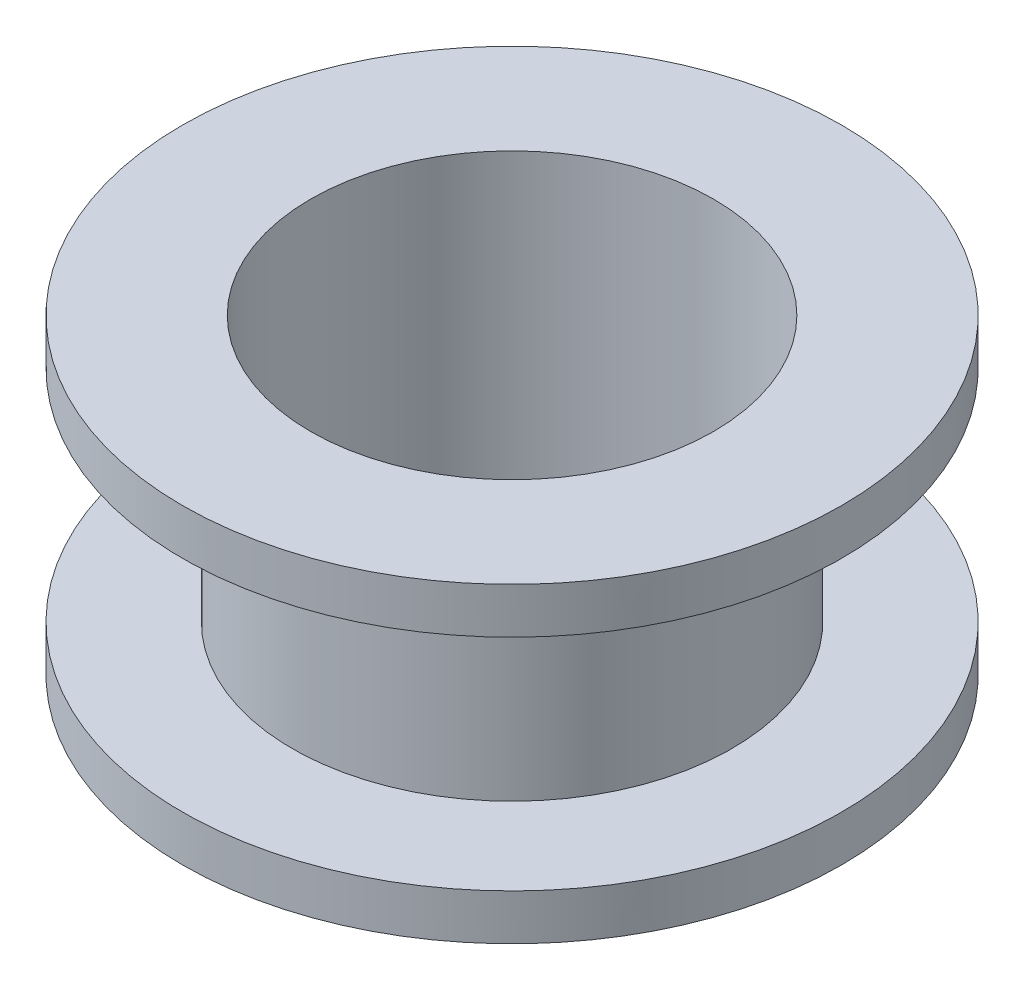
ISO-10303-21;
HEADER;
FILE_DESCRIPTION(('STEP AP214'),'2;1');
FILE_NAME('part.step','',(''),(''),'','','');
FILE_SCHEMA(('AUTOMOTIVE_DESIGN { 1 0 10303 214 1 1 1 1 }'));
ENDSEC;
DATA;
#1=APPLICATION_CONTEXT('core data for automotive mechanical design processes');
#2=APPLICATION_PROTOCOL_DEFINITION('international standard','automotive_design',2000,#1);
#3=PRODUCT_CONTEXT('',#1,'mechanical');
#4=PRODUCT('Part','Part','',(#3));
#5=PRODUCT_RELATED_PRODUCT_CATEGORY('part','',(#4));
#6=PRODUCT_DEFINITION_FORMATION('','',#4);
#7=PRODUCT_DEFINITION_CONTEXT('part definition',#1,'design');
#8=PRODUCT_DEFINITION('design','',#6,#7);
#9=PRODUCT_DEFINITION_SHAPE('','',#8);
#10=(LENGTH_UNIT() NAMED_UNIT(*) SI_UNIT(.MILLI.,.METRE.));
#11=(NAMED_UNIT(*) PLANE_ANGLE_UNIT() SI_UNIT($,.RADIAN.));
#12=(NAMED_UNIT(*) SI_UNIT($,.STERADIAN.) SOLID_ANGLE_UNIT());
#13=UNCERTAINTY_MEASURE_WITH_UNIT(LENGTH_MEASURE(1.E-05),#10,'distance_accuracy_value','');
#14=(GEOMETRIC_REPRESENTATION_CONTEXT(3) GLOBAL_UNCERTAINTY_ASSIGNED_CONTEXT((#13)) GLOBAL_UNIT_ASSIGNED_CONTEXT((#10,
#11,#12)) REPRESENTATION_CONTEXT('',''));
#15=CARTESIAN_POINT('',(0.,0.,0.));
#16=DIRECTION('',(0.,0.,1.));
#17=DIRECTION('',(1.,0.,0.));
#18=AXIS2_PLACEMENT_3D('',#15,#16,#17);
#19=CARTESIAN_POINT('',(0.,8.5,0.));
#20=DIRECTION('',(0.,-1.,0.));
#21=DIRECTION('',(0.,0.,-1.));
#22=AXIS2_PLACEMENT_3D('',#19,#20,#21);
#23=CYLINDRICAL_SURFACE('',#22,9.);
#24=CARTESIAN_POINT('',(0.,1.25,0.));
#25=DIRECTION('',(0.,-1.,0.));
#26=DIRECTION('',(0.,0.,-1.));
#27=AXIS2_PLACEMENT_3D('',#24,#25,#26);
#28=CIRCLE('',#27,9.);
#29=CARTESIAN_POINT('',(0.,1.25,-9.));
#30=VERTEX_POINT('',#29);
#31=EDGE_CURVE('E53',#30,#30,#28,.T.);
#32=ORIENTED_EDGE('',*,*,#31,.T.);
#33=EDGE_LOOP('',(#32));
#34=FACE_BOUND('',#33,.T.);
#35=CARTESIAN_POINT('',(0.,0.,0.));
#36=DIRECTION('',(0.,1.,0.));
#37=DIRECTION('',(0.,0.,1.));
#38=AXIS2_PLACEMENT_3D('',#35,#36,#37);
#39=CIRCLE('',#38,9.);
#40=CARTESIAN_POINT('',(0.,0.,9.));
#41=VERTEX_POINT('',#40);
#42=EDGE_CURVE('E41',#41,#41,#39,.T.);
#43=ORIENTED_EDGE('',*,*,#42,.T.);
#44=EDGE_LOOP('',(#43));
#45=FACE_BOUND('',#44,.T.);
#46=ADVANCED_FACE('F37',(#34,#45),#23,.T.);
#47=CARTESIAN_POINT('',(0.,8.5,0.));
#48=DIRECTION('',(0.,1.,0.));
#49=DIRECTION('',(0.,0.,1.));
#50=AXIS2_PLACEMENT_3D('',#47,#48,#49);
#51=PLANE('',#50);
#52=CARTESIAN_POINT('',(0.,8.5,0.));
#53=DIRECTION('',(0.,1.,0.));
#54=DIRECTION('',(0.,0.,1.));
#55=AXIS2_PLACEMENT_3D('',#52,#53,#54);
#56=CIRCLE('',#55,9.);
#57=CARTESIAN_POINT('',(0.,8.5,9.));
#58=VERTEX_POINT('',#57);
#59=EDGE_CURVE('E10',#58,#58,#56,.T.);
#60=ORIENTED_EDGE('',*,*,#59,.T.);
#61=EDGE_LOOP('',(#60));
#62=FACE_BOUND('',#61,.T.);
#63=CARTESIAN_POINT('',(0.,8.5,0.));
#64=DIRECTION('',(0.,1.,0.));
#65=DIRECTION('',(0.,0.,1.));
#66=AXIS2_PLACEMENT_3D('',#63,#64,#65);
#67=CIRCLE('',#66,5.5);
#68=CARTESIAN_POINT('',(0.,8.5,5.5));
#69=VERTEX_POINT('',#68);
#70=EDGE_CURVE('E48',#69,#69,#67,.T.);
#71=ORIENTED_EDGE('',*,*,#70,.F.);
#72=EDGE_LOOP('',(#71));
#73=FACE_BOUND('',#72,.T.);
#74=ADVANCED_FACE('F81',(#62,#73),#51,.T.);
#75=CARTESIAN_POINT('',(0.,0.,0.));
#76=DIRECTION('',(0.,1.,0.));
#77=DIRECTION('',(0.,0.,1.));
#78=AXIS2_PLACEMENT_3D('',#75,#76,#77);
#79=PLANE('',#78);
#80=ORIENTED_EDGE('',*,*,#42,.F.);
#81=EDGE_LOOP('',(#80));
#82=FACE_BOUND('',#81,.T.);
#83=CARTESIAN_POINT('',(0.,0.,0.));
#84=DIRECTION('',(0.,1.,0.));
#85=DIRECTION('',(0.,0.,1.));
#86=AXIS2_PLACEMENT_3D('',#83,#84,#85);
#87=CIRCLE('',#86,5.5);
#88=CARTESIAN_POINT('',(0.,0.,5.5));
#89=VERTEX_POINT('',#88);
#90=EDGE_CURVE('E50',#89,#89,#87,.T.);
#91=ORIENTED_EDGE('',*,*,#90,.T.);
#92=EDGE_LOOP('',(#91));
#93=FACE_BOUND('',#92,.T.);
#94=ADVANCED_FACE('F73',(#82,#93),#79,.F.);
#95=CARTESIAN_POINT('',(0.,7.25,0.));
#96=DIRECTION('',(0.,-1.,0.));
#97=DIRECTION('',(0.,0.,-1.));
#98=AXIS2_PLACEMENT_3D('',#95,#96,#97);
#99=CIRCLE('',#98,9.);
#100=CARTESIAN_POINT('',(0.,7.25,-9.));
#101=VERTEX_POINT('',#100);
#102=EDGE_CURVE('E64',#101,#101,#99,.T.);
#103=ORIENTED_EDGE('',*,*,#102,.F.);
#104=EDGE_LOOP('',(#103));
#105=FACE_BOUND('',#104,.T.);
#106=ORIENTED_EDGE('',*,*,#59,.F.);
#107=EDGE_LOOP('',(#106));
#108=FACE_BOUND('',#107,.T.);
#109=ADVANCED_FACE('F39',(#105,#108),#23,.T.);
#110=CARTESIAN_POINT('',(0.,8.5,0.));
#111=DIRECTION('',(0.,-1.,0.));
#112=DIRECTION('',(0.,0.,-1.));
#113=AXIS2_PLACEMENT_3D('',#110,#111,#112);
#114=CYLINDRICAL_SURFACE('',#113,5.5);
#115=ORIENTED_EDGE('',*,*,#70,.T.);
#116=EDGE_LOOP('',(#115));
#117=FACE_BOUND('',#116,.T.);
#118=ORIENTED_EDGE('',*,*,#90,.F.);
#119=EDGE_LOOP('',(#118));
#120=FACE_BOUND('',#119,.T.);
#121=ADVANCED_FACE('F72',(#117,#120),#114,.F.);
#122=CARTESIAN_POINT('',(9.,1.25,0.));
#123=DIRECTION('',(0.,-1.,0.));
#124=DIRECTION('',(0.,0.,-1.));
#125=AXIS2_PLACEMENT_3D('',#122,#123,#124);
#126=PLANE('',#125);
#127=ORIENTED_EDGE('',*,*,#31,.F.);
#128=EDGE_LOOP('',(#127));
#129=FACE_BOUND('',#128,.T.);
#130=CARTESIAN_POINT('',(0.,1.25,0.));
#131=DIRECTION('',(0.,-1.,0.));
#132=DIRECTION('',(0.,0.,-1.));
#133=AXIS2_PLACEMENT_3D('',#130,#131,#132);
#134=CIRCLE('',#133,6.);
#135=CARTESIAN_POINT('',(0.,1.25,-6.));
#136=VERTEX_POINT('',#135);
#137=EDGE_CURVE('E58',#136,#136,#134,.T.);
#138=ORIENTED_EDGE('',*,*,#137,.T.);
#139=EDGE_LOOP('',(#138));
#140=FACE_BOUND('',#139,.T.);
#141=ADVANCED_FACE('F78',(#129,#140),#126,.F.);
#142=CARTESIAN_POINT('',(0.,0.,0.));
#143=DIRECTION('',(0.,-1.,0.));
#144=DIRECTION('',(0.,0.,-1.));
#145=AXIS2_PLACEMENT_3D('',#142,#143,#144);
#146=CYLINDRICAL_SURFACE('',#145,6.);
#147=ORIENTED_EDGE('',*,*,#137,.F.);
#148=EDGE_LOOP('',(#147));
#149=FACE_BOUND('',#148,.T.);
#150=CARTESIAN_POINT('',(0.,7.25,0.));
#151=DIRECTION('',(0.,-1.,0.));
#152=DIRECTION('',(0.,0.,-1.));
#153=AXIS2_PLACEMENT_3D('',#150,#151,#152);
#154=CIRCLE('',#153,6.);
#155=CARTESIAN_POINT('',(0.,7.25,-6.));
#156=VERTEX_POINT('',#155);
#157=EDGE_CURVE('E61',#156,#156,#154,.T.);
#158=ORIENTED_EDGE('',*,*,#157,.T.);
#159=EDGE_LOOP('',(#158));
#160=FACE_BOUND('',#159,.T.);
#161=ADVANCED_FACE('F98',(#149,#160),#146,.T.);
#162=CARTESIAN_POINT('',(9.,7.25,0.));
#163=DIRECTION('',(0.,1.,0.));
#164=DIRECTION('',(0.,0.,1.));
#165=AXIS2_PLACEMENT_3D('',#162,#163,#164);
#166=PLANE('',#165);
#167=ORIENTED_EDGE('',*,*,#157,.F.);
#168=EDGE_LOOP('',(#167));
#169=FACE_BOUND('',#168,.T.);
#170=ORIENTED_EDGE('',*,*,#102,.T.);
#171=EDGE_LOOP('',(#170));
#172=FACE_BOUND('',#171,.T.);
#173=ADVANCED_FACE('F68',(#169,#172),#166,.F.);
#174=CLOSED_SHELL('',(#46,#74,#94,#109,#121,#141,#161,#173));
#175=MANIFOLD_SOLID_BREP('B2',#174);
#176=ADVANCED_BREP_SHAPE_REPRESENTATION('',(#18,#175),#14);
#177=SHAPE_DEFINITION_REPRESENTATION(#9,#176);
ENDSEC;
END-ISO-10303-21;
